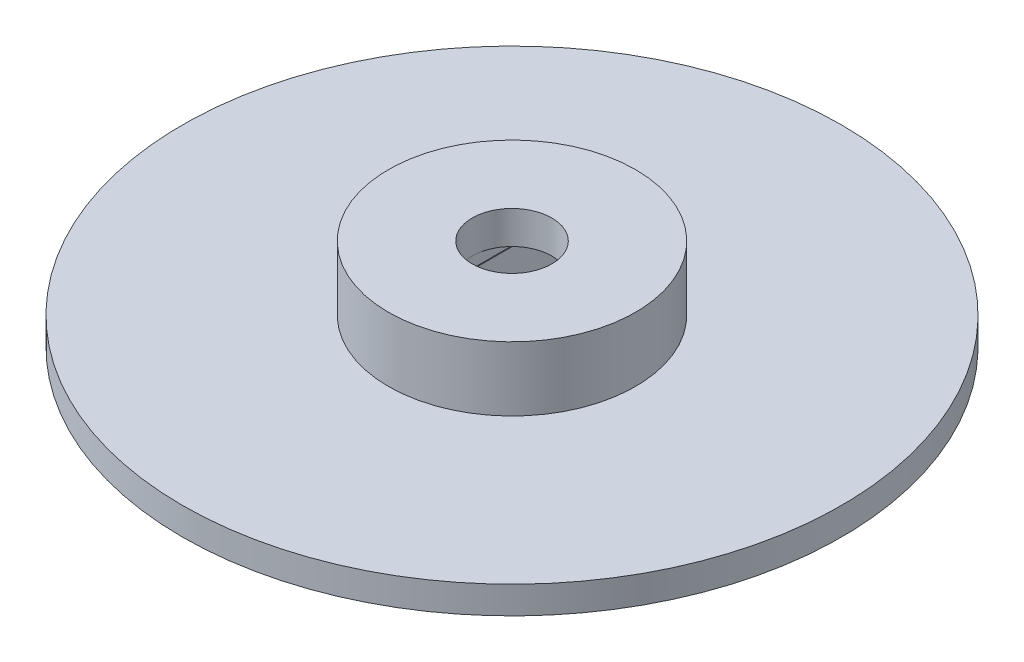
ISO-10303-21;
HEADER;
FILE_DESCRIPTION(('STEP AP214'),'2;1');
FILE_NAME('part.step','',(''),(''),'','','');
FILE_SCHEMA(('AUTOMOTIVE_DESIGN { 1 0 10303 214 1 1 1 1 }'));
ENDSEC;
DATA;
#1=APPLICATION_CONTEXT('core data for automotive mechanical design processes');
#2=APPLICATION_PROTOCOL_DEFINITION('international standard','automotive_design',2000,#1);
#3=PRODUCT_CONTEXT('',#1,'mechanical');
#4=PRODUCT('Part','Part','',(#3));
#5=PRODUCT_RELATED_PRODUCT_CATEGORY('part','',(#4));
#6=PRODUCT_DEFINITION_FORMATION('','',#4);
#7=PRODUCT_DEFINITION_CONTEXT('part definition',#1,'design');
#8=PRODUCT_DEFINITION('design','',#6,#7);
#9=PRODUCT_DEFINITION_SHAPE('','',#8);
#10=(LENGTH_UNIT() NAMED_UNIT(*) SI_UNIT(.MILLI.,.METRE.));
#11=(NAMED_UNIT(*) PLANE_ANGLE_UNIT() SI_UNIT($,.RADIAN.));
#12=(NAMED_UNIT(*) SI_UNIT($,.STERADIAN.) SOLID_ANGLE_UNIT());
#13=UNCERTAINTY_MEASURE_WITH_UNIT(LENGTH_MEASURE(1.E-05),#10,'distance_accuracy_value','');
#14=(GEOMETRIC_REPRESENTATION_CONTEXT(3) GLOBAL_UNCERTAINTY_ASSIGNED_CONTEXT((#13)) GLOBAL_UNIT_ASSIGNED_CONTEXT((#10,
#11,#12)) REPRESENTATION_CONTEXT('',''));
#15=CARTESIAN_POINT('',(0.,0.,0.));
#16=DIRECTION('',(0.,0.,1.));
#17=DIRECTION('',(1.,0.,0.));
#18=AXIS2_PLACEMENT_3D('',#15,#16,#17);
#19=CARTESIAN_POINT('',(0.,5.,0.));
#20=DIRECTION('',(0.,-1.,0.));
#21=DIRECTION('',(0.,0.,-1.));
#22=AXIS2_PLACEMENT_3D('',#19,#20,#21);
#23=CYLINDRICAL_SURFACE('',#22,60.);
#24=CARTESIAN_POINT('',(0.,5.,0.));
#25=DIRECTION('',(0.,1.,0.));
#26=DIRECTION('',(0.,0.,1.));
#27=AXIS2_PLACEMENT_3D('',#24,#25,#26);
#28=CIRCLE('',#27,60.);
#29=CARTESIAN_POINT('',(0.,5.,60.));
#30=VERTEX_POINT('',#29);
#31=EDGE_CURVE('E193',#30,#30,#28,.T.);
#32=ORIENTED_EDGE('',*,*,#31,.F.);
#33=EDGE_LOOP('',(#32));
#34=FACE_BOUND('',#33,.T.);
#35=CARTESIAN_POINT('',(0.,0.,0.));
#36=DIRECTION('',(0.,1.,0.));
#37=DIRECTION('',(0.,0.,1.));
#38=AXIS2_PLACEMENT_3D('',#35,#36,#37);
#39=CIRCLE('',#38,60.);
#40=CARTESIAN_POINT('',(0.,0.,60.));
#41=VERTEX_POINT('',#40);
#42=EDGE_CURVE('E189',#41,#41,#39,.T.);
#43=ORIENTED_EDGE('',*,*,#42,.T.);
#44=EDGE_LOOP('',(#43));
#45=FACE_BOUND('',#44,.T.);
#46=ADVANCED_FACE('F33',(#34,#45),#23,.T.);
#47=CARTESIAN_POINT('',(0.,5.,0.));
#48=DIRECTION('',(0.,1.,0.));
#49=DIRECTION('',(0.,0.,1.));
#50=AXIS2_PLACEMENT_3D('',#47,#48,#49);
#51=PLANE('',#50);
#52=CARTESIAN_POINT('',(0.,5.,0.));
#53=DIRECTION('',(0.,1.,0.));
#54=DIRECTION('',(0.,0.,1.));
#55=AXIS2_PLACEMENT_3D('',#52,#53,#54);
#56=CIRCLE('',#55,22.5);
#57=CARTESIAN_POINT('',(0.,5.,22.5));
#58=VERTEX_POINT('',#57);
#59=EDGE_CURVE('E190',#58,#58,#56,.T.);
#60=ORIENTED_EDGE('',*,*,#59,.F.);
#61=EDGE_LOOP('',(#60));
#62=FACE_BOUND('',#61,.T.);
#63=ORIENTED_EDGE('',*,*,#31,.T.);
#64=EDGE_LOOP('',(#63));
#65=FACE_BOUND('',#64,.T.);
#66=ADVANCED_FACE('F261',(#62,#65),#51,.T.);
#67=CARTESIAN_POINT('',(0.,0.,0.));
#68=DIRECTION('',(0.,1.,0.));
#69=DIRECTION('',(0.,0.,1.));
#70=AXIS2_PLACEMENT_3D('',#67,#68,#69);
#71=PLANE('',#70);
#72=DIRECTION('',(-1.,0.,0.));
#73=VECTOR('',#72,1.);
#74=CARTESIAN_POINT('',(0.,0.,-20.05));
#75=LINE('',#74,#73);
#76=CARTESIAN_POINT('',(7.40339841345054,0.,-20.05));
#77=VERTEX_POINT('',#76);
#78=CARTESIAN_POINT('',(-7.09660158654946,0.,-20.05));
#79=VERTEX_POINT('',#78);
#80=EDGE_CURVE('E40',#77,#79,#75,.T.);
#81=ORIENTED_EDGE('',*,*,#80,.T.);
#82=DIRECTION('',(0.,0.,1.));
#83=VECTOR('',#82,1.);
#84=CARTESIAN_POINT('',(-7.09660158654945,0.,0.));
#85=LINE('',#84,#83);
#86=CARTESIAN_POINT('',(-7.09660158654945,0.,11.75));
#87=VERTEX_POINT('',#86);
#88=EDGE_CURVE('E11',#79,#87,#85,.T.);
#89=ORIENTED_EDGE('',*,*,#88,.T.);
#90=DIRECTION('',(1.,0.,0.));
#91=VECTOR('',#90,1.);
#92=CARTESIAN_POINT('',(0.,0.,11.75));
#93=LINE('',#92,#91);
#94=CARTESIAN_POINT('',(7.40339841345055,0.,11.75));
#95=VERTEX_POINT('',#94);
#96=EDGE_CURVE('E124',#87,#95,#93,.T.);
#97=ORIENTED_EDGE('',*,*,#96,.T.);
#98=DIRECTION('',(0.,0.,-1.));
#99=VECTOR('',#98,1.);
#100=CARTESIAN_POINT('',(7.40339841345055,0.,0.));
#101=LINE('',#100,#99);
#102=EDGE_CURVE('E199',#95,#77,#101,.T.);
#103=ORIENTED_EDGE('',*,*,#102,.T.);
#104=EDGE_LOOP('',(#81,#89,#97,#103));
#105=FACE_BOUND('',#104,.T.);
#106=ORIENTED_EDGE('',*,*,#42,.F.);
#107=EDGE_LOOP('',(#106));
#108=FACE_BOUND('',#107,.T.);
#109=ADVANCED_FACE('F203',(#105,#108),#71,.F.);
#110=CARTESIAN_POINT('',(0.,16.7,0.));
#111=DIRECTION('',(0.,-1.,0.));
#112=DIRECTION('',(0.,0.,-1.));
#113=AXIS2_PLACEMENT_3D('',#110,#111,#112);
#114=CYLINDRICAL_SURFACE('',#113,22.5);
#115=CARTESIAN_POINT('',(0.,16.7,0.));
#116=DIRECTION('',(0.,1.,0.));
#117=DIRECTION('',(0.,0.,1.));
#118=AXIS2_PLACEMENT_3D('',#115,#116,#117);
#119=CIRCLE('',#118,22.5);
#120=CARTESIAN_POINT('',(0.,16.7,22.5));
#121=VERTEX_POINT('',#120);
#122=EDGE_CURVE('E182',#121,#121,#119,.T.);
#123=ORIENTED_EDGE('',*,*,#122,.F.);
#124=EDGE_LOOP('',(#123));
#125=FACE_BOUND('',#124,.T.);
#126=ORIENTED_EDGE('',*,*,#59,.T.);
#127=EDGE_LOOP('',(#126));
#128=FACE_BOUND('',#127,.T.);
#129=ADVANCED_FACE('F272',(#125,#128),#114,.T.);
#130=CARTESIAN_POINT('',(0.,16.7,0.));
#131=DIRECTION('',(0.,1.,0.));
#132=DIRECTION('',(0.,0.,1.));
#133=AXIS2_PLACEMENT_3D('',#130,#131,#132);
#134=PLANE('',#133);
#135=CARTESIAN_POINT('',(0.,16.7,0.));
#136=DIRECTION('',(0.,1.,0.));
#137=DIRECTION('',(0.,0.,1.));
#138=AXIS2_PLACEMENT_3D('',#135,#136,#137);
#139=CIRCLE('',#138,7.25);
#140=CARTESIAN_POINT('',(0.,16.7,7.25));
#141=VERTEX_POINT('',#140);
#142=EDGE_CURVE('E171',#141,#141,#139,.T.);
#143=ORIENTED_EDGE('',*,*,#142,.F.);
#144=EDGE_LOOP('',(#143));
#145=FACE_BOUND('',#144,.T.);
#146=ORIENTED_EDGE('',*,*,#122,.T.);
#147=EDGE_LOOP('',(#146));
#148=FACE_BOUND('',#147,.T.);
#149=ADVANCED_FACE('F255',(#145,#148),#134,.T.);
#150=CARTESIAN_POINT('',(0.,10.7,0.));
#151=DIRECTION('',(0.,1.,0.));
#152=DIRECTION('',(0.,0.,1.));
#153=AXIS2_PLACEMENT_3D('',#150,#151,#152);
#154=CYLINDRICAL_SURFACE('',#153,7.25);
#155=CARTESIAN_POINT('',(0.,10.7,0.));
#156=DIRECTION('',(0.,1.,0.));
#157=DIRECTION('',(0.,0.,1.));
#158=AXIS2_PLACEMENT_3D('',#155,#156,#157);
#159=CIRCLE('',#158,7.25);
#160=CARTESIAN_POINT('',(0.,10.7,7.25));
#161=VERTEX_POINT('',#160);
#162=CARTESIAN_POINT('',(7.25,10.7,0.));
#163=VERTEX_POINT('',#162);
#164=EDGE_CURVE('E180',#161,#163,#159,.T.);
#165=ORIENTED_EDGE('',*,*,#164,.F.);
#166=CARTESIAN_POINT('',(-7.25,10.7,0.));
#167=VERTEX_POINT('',#166);
#168=EDGE_CURVE('E184',#167,#161,#159,.T.);
#169=ORIENTED_EDGE('',*,*,#168,.F.);
#170=EDGE_CURVE('E183',#163,#167,#159,.T.);
#171=ORIENTED_EDGE('',*,*,#170,.F.);
#172=EDGE_LOOP('',(#165,#169,#171));
#173=FACE_BOUND('',#172,.T.);
#174=ORIENTED_EDGE('',*,*,#142,.T.);
#175=EDGE_LOOP('',(#174));
#176=FACE_BOUND('',#175,.T.);
#177=ADVANCED_FACE('F245',(#173,#176),#154,.F.);
#178=CARTESIAN_POINT('',(0.,10.7,0.));
#179=DIRECTION('',(0.,1.,0.));
#180=DIRECTION('',(0.,0.,1.));
#181=AXIS2_PLACEMENT_3D('',#178,#179,#180);
#182=PLANE('',#181);
#183=ORIENTED_EDGE('',*,*,#164,.T.);
#184=DIRECTION('',(0.,0.,-1.));
#185=VECTOR('',#184,1.);
#186=CARTESIAN_POINT('',(7.25,10.7,-15.55));
#187=LINE('',#186,#185);
#188=CARTESIAN_POINT('',(7.25,10.7,7.25));
#189=VERTEX_POINT('',#188);
#190=EDGE_CURVE('E164',#189,#163,#187,.T.);
#191=ORIENTED_EDGE('',*,*,#190,.F.);
#192=DIRECTION('',(1.,0.,0.));
#193=VECTOR('',#192,1.);
#194=CARTESIAN_POINT('',(-7.25,10.7,7.25));
#195=LINE('',#194,#193);
#196=EDGE_CURVE('E159',#161,#189,#195,.T.);
#197=ORIENTED_EDGE('',*,*,#196,.F.);
#198=EDGE_LOOP('',(#183,#191,#197));
#199=FACE_BOUND('',#198,.T.);
#200=ADVANCED_FACE('F248',(#199),#182,.F.);
#201=ORIENTED_EDGE('',*,*,#170,.T.);
#202=DIRECTION('',(0.,0.,1.));
#203=VECTOR('',#202,1.);
#204=CARTESIAN_POINT('',(-7.25,10.7,-15.55));
#205=LINE('',#204,#203);
#206=CARTESIAN_POINT('',(-7.25,10.7,-15.55));
#207=VERTEX_POINT('',#206);
#208=EDGE_CURVE('E157',#207,#167,#205,.T.);
#209=ORIENTED_EDGE('',*,*,#208,.F.);
#210=DIRECTION('',(-1.,0.,0.));
#211=VECTOR('',#210,1.);
#212=CARTESIAN_POINT('',(-7.25,10.7,-15.55));
#213=LINE('',#212,#211);
#214=CARTESIAN_POINT('',(7.25,10.7,-15.55));
#215=VERTEX_POINT('',#214);
#216=EDGE_CURVE('E147',#215,#207,#213,.T.);
#217=ORIENTED_EDGE('',*,*,#216,.F.);
#218=EDGE_CURVE('E163',#163,#215,#187,.T.);
#219=ORIENTED_EDGE('',*,*,#218,.F.);
#220=EDGE_LOOP('',(#201,#209,#217,#219));
#221=FACE_BOUND('',#220,.T.);
#222=ADVANCED_FACE('F238',(#221),#182,.F.);
#223=CARTESIAN_POINT('',(-7.25,8.7,-15.55));
#224=DIRECTION('',(-1.,0.,0.));
#225=DIRECTION('',(0.,0.,1.));
#226=AXIS2_PLACEMENT_3D('',#223,#224,#225);
#227=PLANE('',#226);
#228=ORIENTED_EDGE('',*,*,#208,.T.);
#229=CARTESIAN_POINT('',(-7.25,10.7,7.25));
#230=VERTEX_POINT('',#229);
#231=EDGE_CURVE('E139',#167,#230,#205,.T.);
#232=ORIENTED_EDGE('',*,*,#231,.T.);
#233=DIRECTION('',(0.,1.,0.));
#234=VECTOR('',#233,1.);
#235=CARTESIAN_POINT('',(-7.25,8.7,7.25));
#236=LINE('',#235,#234);
#237=CARTESIAN_POINT('',(-7.25,8.7,7.25));
#238=VERTEX_POINT('',#237);
#239=EDGE_CURVE('E156',#238,#230,#236,.T.);
#240=ORIENTED_EDGE('',*,*,#239,.F.);
#241=DIRECTION('',(0.,0.,1.));
#242=VECTOR('',#241,1.);
#243=CARTESIAN_POINT('',(-7.25,8.7,-15.55));
#244=LINE('',#243,#242);
#245=CARTESIAN_POINT('',(-7.25,8.7,-15.55));
#246=VERTEX_POINT('',#245);
#247=EDGE_CURVE('E143',#246,#238,#244,.T.);
#248=ORIENTED_EDGE('',*,*,#247,.F.);
#249=DIRECTION('',(0.,1.,0.));
#250=VECTOR('',#249,1.);
#251=CARTESIAN_POINT('',(-7.25,8.7,-15.55));
#252=LINE('',#251,#250);
#253=EDGE_CURVE('E169',#246,#207,#252,.T.);
#254=ORIENTED_EDGE('',*,*,#253,.T.);
#255=EDGE_LOOP('',(#228,#232,#240,#248,#254));
#256=FACE_BOUND('',#255,.T.);
#257=ADVANCED_FACE('F225',(#256),#227,.F.);
#258=CARTESIAN_POINT('',(-7.25,8.7,-15.55));
#259=DIRECTION('',(0.,0.,-1.));
#260=DIRECTION('',(-1.,0.,0.));
#261=AXIS2_PLACEMENT_3D('',#258,#259,#260);
#262=PLANE('',#261);
#263=ORIENTED_EDGE('',*,*,#216,.T.);
#264=ORIENTED_EDGE('',*,*,#253,.F.);
#265=DIRECTION('',(-1.,0.,0.));
#266=VECTOR('',#265,1.);
#267=CARTESIAN_POINT('',(-7.25,8.7,-15.55));
#268=LINE('',#267,#266);
#269=CARTESIAN_POINT('',(-7.09660158654945,8.7,-15.55));
#270=VERTEX_POINT('',#269);
#271=EDGE_CURVE('E153',#270,#246,#268,.T.);
#272=ORIENTED_EDGE('',*,*,#271,.F.);
#273=CARTESIAN_POINT('',(7.25,8.7,-15.55));
#274=VERTEX_POINT('',#273);
#275=EDGE_CURVE('E154',#274,#270,#268,.T.);
#276=ORIENTED_EDGE('',*,*,#275,.F.);
#277=DIRECTION('',(0.,1.,0.));
#278=VECTOR('',#277,1.);
#279=CARTESIAN_POINT('',(7.25,8.7,-15.55));
#280=LINE('',#279,#278);
#281=EDGE_CURVE('E172',#274,#215,#280,.T.);
#282=ORIENTED_EDGE('',*,*,#281,.T.);
#283=EDGE_LOOP('',(#263,#264,#272,#276,#282));
#284=FACE_BOUND('',#283,.T.);
#285=ADVANCED_FACE('F220',(#284),#262,.F.);
#286=CARTESIAN_POINT('',(7.25,8.7,-15.55));
#287=DIRECTION('',(1.,0.,0.));
#288=DIRECTION('',(0.,0.,-1.));
#289=AXIS2_PLACEMENT_3D('',#286,#287,#288);
#290=PLANE('',#289);
#291=ORIENTED_EDGE('',*,*,#190,.T.);
#292=ORIENTED_EDGE('',*,*,#218,.T.);
#293=ORIENTED_EDGE('',*,*,#281,.F.);
#294=DIRECTION('',(0.,0.,-1.));
#295=VECTOR('',#294,1.);
#296=CARTESIAN_POINT('',(7.25,8.7,-15.55));
#297=LINE('',#296,#295);
#298=CARTESIAN_POINT('',(7.25,8.7,7.25));
#299=VERTEX_POINT('',#298);
#300=EDGE_CURVE('E151',#299,#274,#297,.T.);
#301=ORIENTED_EDGE('',*,*,#300,.F.);
#302=DIRECTION('',(0.,1.,0.));
#303=VECTOR('',#302,1.);
#304=CARTESIAN_POINT('',(7.25,8.7,7.25));
#305=LINE('',#304,#303);
#306=EDGE_CURVE('E175',#299,#189,#305,.T.);
#307=ORIENTED_EDGE('',*,*,#306,.T.);
#308=EDGE_LOOP('',(#291,#292,#293,#301,#307));
#309=FACE_BOUND('',#308,.T.);
#310=ADVANCED_FACE('F234',(#309),#290,.F.);
#311=CARTESIAN_POINT('',(-7.25,8.7,7.25));
#312=DIRECTION('',(0.,0.,1.));
#313=DIRECTION('',(1.,0.,0.));
#314=AXIS2_PLACEMENT_3D('',#311,#312,#313);
#315=PLANE('',#314);
#316=EDGE_CURVE('E160',#230,#161,#195,.T.);
#317=ORIENTED_EDGE('',*,*,#316,.T.);
#318=ORIENTED_EDGE('',*,*,#196,.T.);
#319=ORIENTED_EDGE('',*,*,#306,.F.);
#320=DIRECTION('',(1.,0.,0.));
#321=VECTOR('',#320,1.);
#322=CARTESIAN_POINT('',(-7.25,8.7,7.25));
#323=LINE('',#322,#321);
#324=CARTESIAN_POINT('',(-7.09660158654945,8.7,7.25));
#325=VERTEX_POINT('',#324);
#326=EDGE_CURVE('E146',#325,#299,#323,.T.);
#327=ORIENTED_EDGE('',*,*,#326,.F.);
#328=EDGE_CURVE('E148',#238,#325,#323,.T.);
#329=ORIENTED_EDGE('',*,*,#328,.F.);
#330=ORIENTED_EDGE('',*,*,#239,.T.);
#331=EDGE_LOOP('',(#317,#318,#319,#327,#329,#330));
#332=FACE_BOUND('',#331,.T.);
#333=ADVANCED_FACE('F229',(#332),#315,.F.);
#334=CARTESIAN_POINT('',(0.,8.7,0.));
#335=DIRECTION('',(0.,1.,0.));
#336=DIRECTION('',(0.,0.,1.));
#337=AXIS2_PLACEMENT_3D('',#334,#335,#336);
#338=PLANE('',#337);
#339=DIRECTION('',(0.,0.,1.));
#340=VECTOR('',#339,1.);
#341=CARTESIAN_POINT('',(-7.09660158654946,8.7,-20.05));
#342=LINE('',#341,#340);
#343=EDGE_CURVE('E116',#270,#325,#342,.T.);
#344=ORIENTED_EDGE('',*,*,#343,.F.);
#345=ORIENTED_EDGE('',*,*,#271,.T.);
#346=ORIENTED_EDGE('',*,*,#247,.T.);
#347=ORIENTED_EDGE('',*,*,#328,.T.);
#348=EDGE_LOOP('',(#344,#345,#346,#347));
#349=FACE_BOUND('',#348,.T.);
#350=ADVANCED_FACE('F217',(#349),#338,.T.);
#351=ORIENTED_EDGE('',*,*,#168,.T.);
#352=ORIENTED_EDGE('',*,*,#316,.F.);
#353=ORIENTED_EDGE('',*,*,#231,.F.);
#354=EDGE_LOOP('',(#351,#352,#353));
#355=FACE_BOUND('',#354,.T.);
#356=ADVANCED_FACE('F242',(#355),#182,.F.);
#357=CARTESIAN_POINT('',(-7.09660158654946,-16.3,-20.05));
#358=DIRECTION('',(-1.,0.,0.));
#359=DIRECTION('',(0.,0.,1.));
#360=AXIS2_PLACEMENT_3D('',#357,#358,#359);
#361=PLANE('',#360);
#362=DIRECTION('',(0.,1.,0.));
#363=VECTOR('',#362,1.);
#364=CARTESIAN_POINT('',(-7.09660158654946,-16.3,-20.05));
#365=LINE('',#364,#363);
#366=CARTESIAN_POINT('',(-7.09660158654946,8.7,-20.05));
#367=VERTEX_POINT('',#366);
#368=EDGE_CURVE('E137',#79,#367,#365,.T.);
#369=ORIENTED_EDGE('',*,*,#368,.T.);
#370=EDGE_CURVE('E47',#367,#270,#342,.T.);
#371=ORIENTED_EDGE('',*,*,#370,.T.);
#372=ORIENTED_EDGE('',*,*,#343,.T.);
#373=CARTESIAN_POINT('',(-7.09660158654945,8.7,11.75));
#374=VERTEX_POINT('',#373);
#375=EDGE_CURVE('E111',#325,#374,#342,.T.);
#376=ORIENTED_EDGE('',*,*,#375,.T.);
#377=DIRECTION('',(0.,1.,0.));
#378=VECTOR('',#377,1.);
#379=CARTESIAN_POINT('',(-7.09660158654945,-16.3,11.75));
#380=LINE('',#379,#378);
#381=EDGE_CURVE('E114',#87,#374,#380,.T.);
#382=ORIENTED_EDGE('',*,*,#381,.F.);
#383=ORIENTED_EDGE('',*,*,#88,.F.);
#384=EDGE_LOOP('',(#369,#371,#372,#376,#382,#383));
#385=FACE_BOUND('',#384,.T.);
#386=ADVANCED_FACE('F113',(#385),#361,.F.);
#387=CARTESIAN_POINT('',(-7.09660158654946,-16.3,-20.05));
#388=DIRECTION('',(0.,0.,-1.));
#389=DIRECTION('',(-1.,0.,0.));
#390=AXIS2_PLACEMENT_3D('',#387,#388,#389);
#391=PLANE('',#390);
#392=DIRECTION('',(0.,1.,0.));
#393=VECTOR('',#392,1.);
#394=CARTESIAN_POINT('',(7.40339841345054,-16.3,-20.05));
#395=LINE('',#394,#393);
#396=CARTESIAN_POINT('',(7.40339841345054,8.7,-20.05));
#397=VERTEX_POINT('',#396);
#398=EDGE_CURVE('E140',#77,#397,#395,.T.);
#399=ORIENTED_EDGE('',*,*,#398,.T.);
#400=DIRECTION('',(-1.,0.,0.));
#401=VECTOR('',#400,1.);
#402=CARTESIAN_POINT('',(-7.09660158654946,8.7,-20.05));
#403=LINE('',#402,#401);
#404=EDGE_CURVE('E125',#397,#367,#403,.T.);
#405=ORIENTED_EDGE('',*,*,#404,.T.);
#406=ORIENTED_EDGE('',*,*,#368,.F.);
#407=ORIENTED_EDGE('',*,*,#80,.F.);
#408=EDGE_LOOP('',(#399,#405,#406,#407));
#409=FACE_BOUND('',#408,.T.);
#410=ADVANCED_FACE('F208',(#409),#391,.F.);
#411=CARTESIAN_POINT('',(7.40339841345054,-16.3,-20.05));
#412=DIRECTION('',(1.,0.,0.));
#413=DIRECTION('',(0.,0.,-1.));
#414=AXIS2_PLACEMENT_3D('',#411,#412,#413);
#415=PLANE('',#414);
#416=DIRECTION('',(0.,1.,0.));
#417=VECTOR('',#416,1.);
#418=CARTESIAN_POINT('',(7.40339841345055,-16.3,11.75));
#419=LINE('',#418,#417);
#420=CARTESIAN_POINT('',(7.40339841345055,8.7,11.75));
#421=VERTEX_POINT('',#420);
#422=EDGE_CURVE('E55',#95,#421,#419,.T.);
#423=ORIENTED_EDGE('',*,*,#422,.T.);
#424=DIRECTION('',(0.,0.,-1.));
#425=VECTOR('',#424,1.);
#426=CARTESIAN_POINT('',(7.40339841345054,8.7,-20.05));
#427=LINE('',#426,#425);
#428=EDGE_CURVE('E131',#421,#397,#427,.T.);
#429=ORIENTED_EDGE('',*,*,#428,.T.);
#430=ORIENTED_EDGE('',*,*,#398,.F.);
#431=ORIENTED_EDGE('',*,*,#102,.F.);
#432=EDGE_LOOP('',(#423,#429,#430,#431));
#433=FACE_BOUND('',#432,.T.);
#434=ADVANCED_FACE('F210',(#433),#415,.F.);
#435=CARTESIAN_POINT('',(-7.09660158654945,-16.3,11.75));
#436=DIRECTION('',(0.,0.,1.));
#437=DIRECTION('',(1.,0.,0.));
#438=AXIS2_PLACEMENT_3D('',#435,#436,#437);
#439=PLANE('',#438);
#440=ORIENTED_EDGE('',*,*,#381,.T.);
#441=DIRECTION('',(1.,0.,0.));
#442=VECTOR('',#441,1.);
#443=CARTESIAN_POINT('',(-7.09660158654945,8.7,11.75));
#444=LINE('',#443,#442);
#445=EDGE_CURVE('E122',#374,#421,#444,.T.);
#446=ORIENTED_EDGE('',*,*,#445,.T.);
#447=ORIENTED_EDGE('',*,*,#422,.F.);
#448=ORIENTED_EDGE('',*,*,#96,.F.);
#449=EDGE_LOOP('',(#440,#446,#447,#448));
#450=FACE_BOUND('',#449,.T.);
#451=ADVANCED_FACE('F121',(#450),#439,.F.);
#452=CARTESIAN_POINT('',(0.,8.7,0.));
#453=DIRECTION('',(0.,1.,0.));
#454=DIRECTION('',(0.,0.,1.));
#455=AXIS2_PLACEMENT_3D('',#452,#453,#454);
#456=PLANE('',#455);
#457=ORIENTED_EDGE('',*,*,#326,.T.);
#458=ORIENTED_EDGE('',*,*,#300,.T.);
#459=ORIENTED_EDGE('',*,*,#275,.T.);
#460=ORIENTED_EDGE('',*,*,#370,.F.);
#461=ORIENTED_EDGE('',*,*,#404,.F.);
#462=ORIENTED_EDGE('',*,*,#428,.F.);
#463=ORIENTED_EDGE('',*,*,#445,.F.);
#464=ORIENTED_EDGE('',*,*,#375,.F.);
#465=EDGE_LOOP('',(#457,#458,#459,#460,#461,#462,#463,#464));
#466=FACE_BOUND('',#465,.T.);
#467=ADVANCED_FACE('F128',(#466),#456,.F.);
#468=CLOSED_SHELL('',(#46,#66,#109,#129,#149,#177,#200,#222,#257,#285,#310,#333,#350,#356,#386,
#410,#434,#451,#467));
#469=MANIFOLD_SOLID_BREP('B2',#468);
#470=ADVANCED_BREP_SHAPE_REPRESENTATION('',(#18,#469),#14);
#471=SHAPE_DEFINITION_REPRESENTATION(#9,#470);
ENDSEC;
END-ISO-10303-21;
